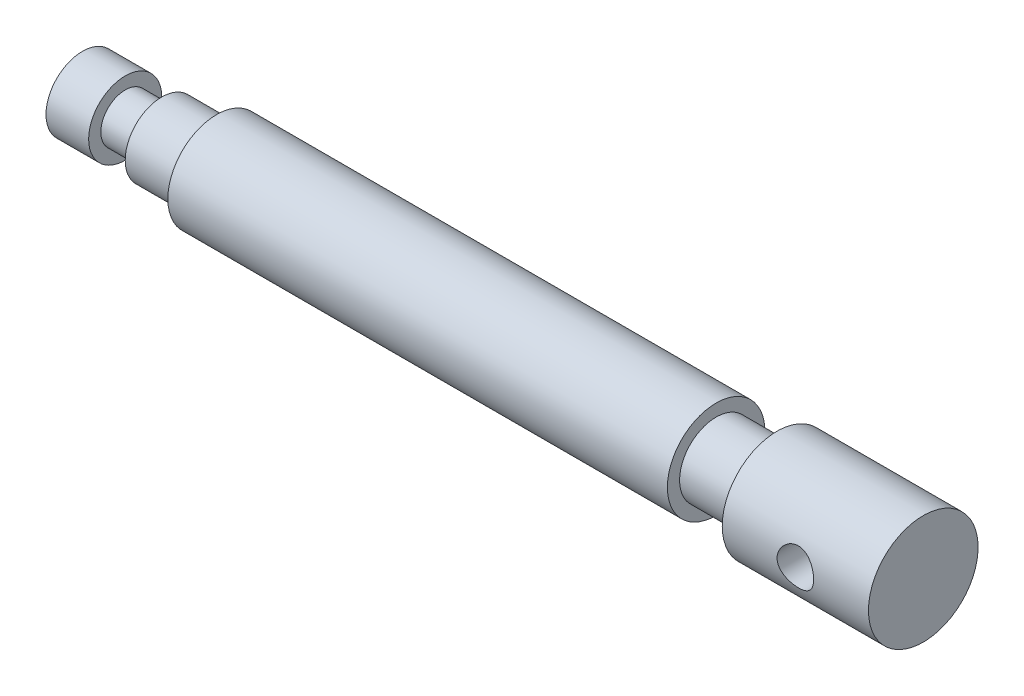
ISO-10303-21;
HEADER;
FILE_DESCRIPTION(('STEP AP214'),'2;1');
FILE_NAME('part.step','',(''),(''),'','','');
FILE_SCHEMA(('AUTOMOTIVE_DESIGN { 1 0 10303 214 1 1 1 1 }'));
ENDSEC;
DATA;
#1=APPLICATION_CONTEXT('core data for automotive mechanical design processes');
#2=APPLICATION_PROTOCOL_DEFINITION('international standard','automotive_design',2000,#1);
#3=PRODUCT_CONTEXT('',#1,'mechanical');
#4=PRODUCT('Part','Part','',(#3));
#5=PRODUCT_RELATED_PRODUCT_CATEGORY('part','',(#4));
#6=PRODUCT_DEFINITION_FORMATION('','',#4);
#7=PRODUCT_DEFINITION_CONTEXT('part definition',#1,'design');
#8=PRODUCT_DEFINITION('design','',#6,#7);
#9=PRODUCT_DEFINITION_SHAPE('','',#8);
#10=(LENGTH_UNIT() NAMED_UNIT(*) SI_UNIT(.MILLI.,.METRE.));
#11=(NAMED_UNIT(*) PLANE_ANGLE_UNIT() SI_UNIT($,.RADIAN.));
#12=(NAMED_UNIT(*) SI_UNIT($,.STERADIAN.) SOLID_ANGLE_UNIT());
#13=UNCERTAINTY_MEASURE_WITH_UNIT(LENGTH_MEASURE(1.E-05),#10,'distance_accuracy_value','');
#14=(GEOMETRIC_REPRESENTATION_CONTEXT(3) GLOBAL_UNCERTAINTY_ASSIGNED_CONTEXT((#13)) GLOBAL_UNIT_ASSIGNED_CONTEXT((#10,
#11,#12)) REPRESENTATION_CONTEXT('',''));
#15=CARTESIAN_POINT('',(0.,0.,0.));
#16=DIRECTION('',(0.,0.,1.));
#17=DIRECTION('',(1.,0.,0.));
#18=AXIS2_PLACEMENT_3D('',#15,#16,#17);
#19=CARTESIAN_POINT('',(0.,0.,0.));
#20=DIRECTION('',(1.,0.,0.));
#21=DIRECTION('',(0.,0.,-1.));
#22=AXIS2_PLACEMENT_3D('',#19,#20,#21);
#23=PLANE('',#22);
#24=CARTESIAN_POINT('',(0.,0.,0.));
#25=DIRECTION('',(-1.,0.,0.));
#26=DIRECTION('',(0.,0.,1.));
#27=AXIS2_PLACEMENT_3D('',#24,#25,#26);
#28=CIRCLE('',#27,6.);
#29=CARTESIAN_POINT('',(0.,0.,6.));
#30=VERTEX_POINT('',#29);
#31=EDGE_CURVE('E43',#30,#30,#28,.T.);
#32=ORIENTED_EDGE('',*,*,#31,.T.);
#33=EDGE_LOOP('',(#32));
#34=FACE_BOUND('',#33,.T.);
#35=ADVANCED_FACE('F32',(#34),#23,.F.);
#36=CARTESIAN_POINT('',(-23.4007089869124,0.,0.));
#37=DIRECTION('',(-1.,0.,0.));
#38=DIRECTION('',(0.,0.,1.));
#39=AXIS2_PLACEMENT_3D('',#36,#37,#38);
#40=CYLINDRICAL_SURFACE('',#39,6.);
#41=ORIENTED_EDGE('',*,*,#31,.F.);
#42=EDGE_LOOP('',(#41));
#43=FACE_BOUND('',#42,.T.);
#44=CARTESIAN_POINT('',(7.,0.,0.));
#45=DIRECTION('',(-1.,0.,0.));
#46=DIRECTION('',(0.,0.,1.));
#47=AXIS2_PLACEMENT_3D('',#44,#45,#46);
#48=CIRCLE('',#47,6.);
#49=CARTESIAN_POINT('',(7.,0.,6.));
#50=VERTEX_POINT('',#49);
#51=EDGE_CURVE('E47',#50,#50,#48,.T.);
#52=ORIENTED_EDGE('',*,*,#51,.T.);
#53=EDGE_LOOP('',(#52));
#54=FACE_BOUND('',#53,.T.);
#55=ADVANCED_FACE('F79',(#43,#54),#40,.T.);
#56=CARTESIAN_POINT('',(7.,6.,0.));
#57=DIRECTION('',(-1.,0.,0.));
#58=DIRECTION('',(0.,0.,1.));
#59=AXIS2_PLACEMENT_3D('',#56,#57,#58);
#60=PLANE('',#59);
#61=ORIENTED_EDGE('',*,*,#51,.F.);
#62=EDGE_LOOP('',(#61));
#63=FACE_BOUND('',#62,.T.);
#64=CARTESIAN_POINT('',(7.,0.,0.));
#65=DIRECTION('',(-1.,0.,0.));
#66=DIRECTION('',(0.,0.,1.));
#67=AXIS2_PLACEMENT_3D('',#64,#65,#66);
#68=CIRCLE('',#67,4.);
#69=CARTESIAN_POINT('',(7.,0.,4.));
#70=VERTEX_POINT('',#69);
#71=EDGE_CURVE('E52',#70,#70,#68,.T.);
#72=ORIENTED_EDGE('',*,*,#71,.T.);
#73=EDGE_LOOP('',(#72));
#74=FACE_BOUND('',#73,.T.);
#75=ADVANCED_FACE('F83',(#63,#74),#60,.F.);
#76=CARTESIAN_POINT('',(-23.4007089869124,0.,0.));
#77=DIRECTION('',(-1.,0.,0.));
#78=DIRECTION('',(0.,0.,1.));
#79=AXIS2_PLACEMENT_3D('',#76,#77,#78);
#80=CYLINDRICAL_SURFACE('',#79,4.);
#81=ORIENTED_EDGE('',*,*,#71,.F.);
#82=EDGE_LOOP('',(#81));
#83=FACE_BOUND('',#82,.T.);
#84=CARTESIAN_POINT('',(13.,0.,0.));
#85=DIRECTION('',(-1.,0.,0.));
#86=DIRECTION('',(0.,0.,1.));
#87=AXIS2_PLACEMENT_3D('',#84,#85,#86);
#88=CIRCLE('',#87,4.);
#89=CARTESIAN_POINT('',(13.,0.,4.));
#90=VERTEX_POINT('',#89);
#91=EDGE_CURVE('E151',#90,#90,#88,.T.);
#92=ORIENTED_EDGE('',*,*,#91,.T.);
#93=EDGE_LOOP('',(#92));
#94=FACE_BOUND('',#93,.T.);
#95=ADVANCED_FACE('F88',(#83,#94),#80,.T.);
#96=CARTESIAN_POINT('',(13.,4.,0.));
#97=DIRECTION('',(1.,0.,0.));
#98=DIRECTION('',(0.,0.,-1.));
#99=AXIS2_PLACEMENT_3D('',#96,#97,#98);
#100=PLANE('',#99);
#101=ORIENTED_EDGE('',*,*,#91,.F.);
#102=EDGE_LOOP('',(#101));
#103=FACE_BOUND('',#102,.T.);
#104=CARTESIAN_POINT('',(13.,0.,0.));
#105=DIRECTION('',(-1.,0.,0.));
#106=DIRECTION('',(0.,0.,1.));
#107=AXIS2_PLACEMENT_3D('',#104,#105,#106);
#108=CIRCLE('',#107,6.);
#109=CARTESIAN_POINT('',(13.,0.,6.));
#110=VERTEX_POINT('',#109);
#111=EDGE_CURVE('E148',#110,#110,#108,.T.);
#112=ORIENTED_EDGE('',*,*,#111,.T.);
#113=EDGE_LOOP('',(#112));
#114=FACE_BOUND('',#113,.T.);
#115=ADVANCED_FACE('F95',(#103,#114),#100,.F.);
#116=CARTESIAN_POINT('',(-23.4007089869124,0.,0.));
#117=DIRECTION('',(-1.,0.,0.));
#118=DIRECTION('',(0.,0.,1.));
#119=AXIS2_PLACEMENT_3D('',#116,#117,#118);
#120=CYLINDRICAL_SURFACE('',#119,6.);
#121=ORIENTED_EDGE('',*,*,#111,.F.);
#122=EDGE_LOOP('',(#121));
#123=FACE_BOUND('',#122,.T.);
#124=CARTESIAN_POINT('',(22.,0.,0.));
#125=DIRECTION('',(-1.,0.,0.));
#126=DIRECTION('',(0.,0.,1.));
#127=AXIS2_PLACEMENT_3D('',#124,#125,#126);
#128=CIRCLE('',#127,6.);
#129=CARTESIAN_POINT('',(22.,0.,6.));
#130=VERTEX_POINT('',#129);
#131=EDGE_CURVE('E145',#130,#130,#128,.T.);
#132=ORIENTED_EDGE('',*,*,#131,.T.);
#133=EDGE_LOOP('',(#132));
#134=FACE_BOUND('',#133,.T.);
#135=ADVANCED_FACE('F99',(#123,#134),#120,.T.);
#136=CARTESIAN_POINT('',(22.,6.,0.));
#137=DIRECTION('',(1.,0.,0.));
#138=DIRECTION('',(0.,0.,-1.));
#139=AXIS2_PLACEMENT_3D('',#136,#137,#138);
#140=PLANE('',#139);
#141=ORIENTED_EDGE('',*,*,#131,.F.);
#142=EDGE_LOOP('',(#141));
#143=FACE_BOUND('',#142,.T.);
#144=CARTESIAN_POINT('',(22.,0.,0.));
#145=DIRECTION('',(-1.,0.,0.));
#146=DIRECTION('',(0.,0.,1.));
#147=AXIS2_PLACEMENT_3D('',#144,#145,#146);
#148=CIRCLE('',#147,8.);
#149=CARTESIAN_POINT('',(22.,0.,8.));
#150=VERTEX_POINT('',#149);
#151=EDGE_CURVE('E142',#150,#150,#148,.T.);
#152=ORIENTED_EDGE('',*,*,#151,.T.);
#153=EDGE_LOOP('',(#152));
#154=FACE_BOUND('',#153,.T.);
#155=ADVANCED_FACE('F103',(#143,#154),#140,.F.);
#156=CARTESIAN_POINT('',(-23.4007089869124,0.,0.));
#157=DIRECTION('',(-1.,0.,0.));
#158=DIRECTION('',(0.,0.,1.));
#159=AXIS2_PLACEMENT_3D('',#156,#157,#158);
#160=CYLINDRICAL_SURFACE('',#159,8.);
#161=ORIENTED_EDGE('',*,*,#151,.F.);
#162=EDGE_LOOP('',(#161));
#163=FACE_BOUND('',#162,.T.);
#164=CARTESIAN_POINT('',(104.,0.,0.));
#165=DIRECTION('',(-1.,0.,0.));
#166=DIRECTION('',(0.,0.,1.));
#167=AXIS2_PLACEMENT_3D('',#164,#165,#166);
#168=CIRCLE('',#167,8.);
#169=CARTESIAN_POINT('',(104.,0.,8.));
#170=VERTEX_POINT('',#169);
#171=EDGE_CURVE('E139',#170,#170,#168,.T.);
#172=ORIENTED_EDGE('',*,*,#171,.T.);
#173=EDGE_LOOP('',(#172));
#174=FACE_BOUND('',#173,.T.);
#175=ADVANCED_FACE('F107',(#163,#174),#160,.T.);
#176=CARTESIAN_POINT('',(104.,8.,0.));
#177=DIRECTION('',(-1.,0.,0.));
#178=DIRECTION('',(0.,0.,1.));
#179=AXIS2_PLACEMENT_3D('',#176,#177,#178);
#180=PLANE('',#179);
#181=ORIENTED_EDGE('',*,*,#171,.F.);
#182=EDGE_LOOP('',(#181));
#183=FACE_BOUND('',#182,.T.);
#184=CARTESIAN_POINT('',(104.,0.,0.));
#185=DIRECTION('',(-1.,0.,0.));
#186=DIRECTION('',(0.,0.,1.));
#187=AXIS2_PLACEMENT_3D('',#184,#185,#186);
#188=CIRCLE('',#187,6.);
#189=CARTESIAN_POINT('',(104.,0.,6.));
#190=VERTEX_POINT('',#189);
#191=EDGE_CURVE('E132',#190,#190,#188,.T.);
#192=ORIENTED_EDGE('',*,*,#191,.T.);
#193=EDGE_LOOP('',(#192));
#194=FACE_BOUND('',#193,.T.);
#195=ADVANCED_FACE('F111',(#183,#194),#180,.F.);
#196=CARTESIAN_POINT('',(-23.4007089869124,0.,0.));
#197=DIRECTION('',(-1.,0.,0.));
#198=DIRECTION('',(0.,0.,1.));
#199=AXIS2_PLACEMENT_3D('',#196,#197,#198);
#200=CYLINDRICAL_SURFACE('',#199,6.);
#201=ORIENTED_EDGE('',*,*,#191,.F.);
#202=EDGE_LOOP('',(#201));
#203=FACE_BOUND('',#202,.T.);
#204=CARTESIAN_POINT('',(114.,0.,0.));
#205=DIRECTION('',(-1.,0.,0.));
#206=DIRECTION('',(0.,0.,1.));
#207=AXIS2_PLACEMENT_3D('',#204,#205,#206);
#208=CIRCLE('',#207,6.);
#209=CARTESIAN_POINT('',(114.,0.,6.));
#210=VERTEX_POINT('',#209);
#211=EDGE_CURVE('E126',#210,#210,#208,.T.);
#212=ORIENTED_EDGE('',*,*,#211,.T.);
#213=EDGE_LOOP('',(#212));
#214=FACE_BOUND('',#213,.T.);
#215=ADVANCED_FACE('F115',(#203,#214),#200,.T.);
#216=CARTESIAN_POINT('',(114.,6.,0.));
#217=DIRECTION('',(1.,0.,0.));
#218=DIRECTION('',(0.,0.,-1.));
#219=AXIS2_PLACEMENT_3D('',#216,#217,#218);
#220=PLANE('',#219);
#221=ORIENTED_EDGE('',*,*,#211,.F.);
#222=EDGE_LOOP('',(#221));
#223=FACE_BOUND('',#222,.T.);
#224=CARTESIAN_POINT('',(114.,0.,0.));
#225=DIRECTION('',(-1.,0.,0.));
#226=DIRECTION('',(0.,0.,1.));
#227=AXIS2_PLACEMENT_3D('',#224,#225,#226);
#228=CIRCLE('',#227,9.);
#229=CARTESIAN_POINT('',(114.,0.,9.));
#230=VERTEX_POINT('',#229);
#231=EDGE_CURVE('E129',#230,#230,#228,.T.);
#232=ORIENTED_EDGE('',*,*,#231,.T.);
#233=EDGE_LOOP('',(#232));
#234=FACE_BOUND('',#233,.T.);
#235=ADVANCED_FACE('F76',(#223,#234),#220,.F.);
#236=CARTESIAN_POINT('',(-23.4007089869124,0.,0.));
#237=DIRECTION('',(-1.,0.,0.));
#238=DIRECTION('',(0.,0.,1.));
#239=AXIS2_PLACEMENT_3D('',#236,#237,#238);
#240=CYLINDRICAL_SURFACE('',#239,9.);
#241=CARTESIAN_POINT('',(128.999477312383,0.,9.));
#242=CARTESIAN_POINT('',(129.002527490459,-0.163327881839876,9.00000061066477));
#243=CARTESIAN_POINT('',(128.992193229552,-0.326899560264671,8.99551314704815));
#244=CARTESIAN_POINT('',(128.945159763351,-0.649728841487302,8.97797279665083));
#245=CARTESIAN_POINT('',(128.908458767397,-0.80898615051846,8.96491932812712));
#246=CARTESIAN_POINT('',(128.810097421898,-1.11847592093075,8.93158563638168));
#247=CARTESIAN_POINT('',(128.748476712084,-1.26872228217279,8.91131689657828));
#248=CARTESIAN_POINT('',(128.602235613487,-1.55669328191847,8.86555085070725));
#249=CARTESIAN_POINT('',(128.517610612165,-1.69441540181645,8.84005249631355));
#250=CARTESIAN_POINT('',(128.32479635742,-1.95807846397704,8.78547744315961));
#251=CARTESIAN_POINT('',(128.215971660345,-2.083536933449,8.75631582520655));
#252=CARTESIAN_POINT('',(127.979106270205,-2.31482662253438,8.69803601158933));
#253=CARTESIAN_POINT('',(127.85106106663,-2.4206532220345,8.66891782774212));
#254=CARTESIAN_POINT('',(127.574455195578,-2.61301268985936,8.61292868409607));
#255=CARTESIAN_POINT('',(127.425372744222,-2.69882736153785,8.58615825985324));
#256=CARTESIAN_POINT('',(127.113888160603,-2.84402430861066,8.53916787935211));
#257=CARTESIAN_POINT('',(126.951489650729,-2.90341374444095,8.51894614900149));
#258=CARTESIAN_POINT('',(126.623120871115,-2.99222014336445,8.48815536186549));
#259=CARTESIAN_POINT('',(126.457408140531,-3.02249117683116,8.47731225726469));
#260=CARTESIAN_POINT('',(126.122928228779,-3.05491526828602,8.46568425713396));
#261=CARTESIAN_POINT('',(125.954162095575,-3.05707779677416,8.46489597387001));
#262=CARTESIAN_POINT('',(125.626937908099,-3.03379487301386,8.47326429065093));
#263=CARTESIAN_POINT('',(125.468372018028,-3.0096607746303,8.48194853896833));
#264=CARTESIAN_POINT('',(125.157709889819,-2.93674157862371,8.50746872736906));
#265=CARTESIAN_POINT('',(125.005614319777,-2.88795394205208,8.52430550703466));
#266=CARTESIAN_POINT('',(124.710019929326,-2.76660684725138,8.56446104377732));
#267=CARTESIAN_POINT('',(124.566645340641,-2.69377068770755,8.58785474724017));
#268=CARTESIAN_POINT('',(124.293809636597,-2.52656192723921,8.63852407658121));
#269=CARTESIAN_POINT('',(124.164352485224,-2.43218321431031,8.66580080331386));
#270=CARTESIAN_POINT('',(123.915873377772,-2.2187258066288,8.72296207264693));
#271=CARTESIAN_POINT('',(123.797752793645,-2.09861252382033,8.75290837872274));
#272=CARTESIAN_POINT('',(123.583080054168,-1.84001522235148,8.81089563612611));
#273=CARTESIAN_POINT('',(123.486530588665,-1.70152891606294,8.83893634952947));
#274=CARTESIAN_POINT('',(123.316572451131,-1.40755619439191,8.89051917263674));
#275=CARTESIAN_POINT('',(123.243504262399,-1.25186014688302,8.91399329885936));
#276=CARTESIAN_POINT('',(123.124902450381,-0.929416147862092,8.95335216055698));
#277=CARTESIAN_POINT('',(123.07935958109,-0.762671928438807,8.96923944414455));
#278=CARTESIAN_POINT('',(123.018857509404,-0.430309895345415,8.99118494398541));
#279=CARTESIAN_POINT('',(123.002702392456,-0.264934950534401,8.99762533298479));
#280=CARTESIAN_POINT('',(122.997923225779,0.0662974299435991,9.00127860981426));
#281=CARTESIAN_POINT('',(123.009293929312,0.232154767641936,8.99849325613982));
#282=CARTESIAN_POINT('',(123.058306828745,0.554115785274278,8.98432642181965));
#283=CARTESIAN_POINT('',(123.095102791907,0.710361930429039,8.97322088742239));
#284=CARTESIAN_POINT('',(123.192782521296,1.01442085464641,8.94395311830769));
#285=CARTESIAN_POINT('',(123.253669020807,1.16223267458203,8.92579008285852));
#286=CARTESIAN_POINT('',(123.399342279281,1.44908648115283,8.88378667352938));
#287=CARTESIAN_POINT('',(123.484652567261,1.58784410240857,8.85982394524899));
#288=CARTESIAN_POINT('',(123.676194902158,1.8494825910347,8.80892771471358));
#289=CARTESIAN_POINT('',(123.782433246339,1.97235866116061,8.78199331935786));
#290=CARTESIAN_POINT('',(124.018618940931,2.20467673736313,8.72664471768828));
#291=CARTESIAN_POINT('',(124.149435894671,2.3132340203938,8.69821970724471));
#292=CARTESIAN_POINT('',(124.427934988762,2.50699559769301,8.64436909698547));
#293=CARTESIAN_POINT('',(124.575617922348,2.59219879293643,8.61894363835842));
#294=CARTESIAN_POINT('',(124.884403286695,2.73678163616397,8.57413542683686));
#295=CARTESIAN_POINT('',(125.045532519509,2.79610816605801,8.55476512647655));
#296=CARTESIAN_POINT('',(125.376295274571,2.88646010902523,8.52470845332066));
#297=CARTESIAN_POINT('',(125.545924932877,2.91749825989994,8.51401817228903));
#298=CARTESIAN_POINT('',(125.879680787467,2.94918239919429,8.50309261071332));
#299=CARTESIAN_POINT('',(126.043653670073,2.95128084432331,8.50235771359261));
#300=CARTESIAN_POINT('',(126.369511683307,2.92873749805083,8.51014898865102));
#301=CARTESIAN_POINT('',(126.531396995984,2.90409805455276,8.51867434766998));
#302=CARTESIAN_POINT('',(126.844713000789,2.82991308015546,8.54359744042526));
#303=CARTESIAN_POINT('',(126.996298548278,2.78095373900554,8.55980949950158));
#304=CARTESIAN_POINT('',(127.28919848734,2.66005093836726,8.59814690884385));
#305=CARTESIAN_POINT('',(127.430510697066,2.58810261388912,8.62027351059894));
#306=CARTESIAN_POINT('',(127.705182496545,2.41983384131197,8.66904640085157));
#307=CARTESIAN_POINT('',(127.837975713493,2.3226324671914,8.69584118429261));
#308=CARTESIAN_POINT('',(128.085876483304,2.10799684143372,8.75034819676065));
#309=CARTESIAN_POINT('',(128.200978886423,1.99055671938057,8.77806069008764));
#310=CARTESIAN_POINT('',(128.415094625914,1.73294331843201,8.83260578722984));
#311=CARTESIAN_POINT('',(128.513238854817,1.59202726907262,8.85935375370506));
#312=CARTESIAN_POINT('',(128.68441827601,1.29487333543991,8.90763262334093));
#313=CARTESIAN_POINT('',(128.757458685492,1.13863864344299,8.92916461023565));
#314=CARTESIAN_POINT('',(128.873757480259,0.821165309044798,8.96382858504189));
#315=CARTESIAN_POINT('',(128.918016122837,0.660324553857875,8.97724142505026));
#316=CARTESIAN_POINT('',(128.979315698627,0.333072686684504,8.99532550195261));
#317=CARTESIAN_POINT('',(128.996364845302,0.166663271146044,8.99999937686458));
#318=CARTESIAN_POINT('',(128.999477312383,0.,9.));
#319=B_SPLINE_CURVE_WITH_KNOTS('',3,(#241,#242,#243,#244,#245,#246,#247,#248,#249,#250,#251,
#252,#253,#254,#255,#256,#257,#258,#259,#260,#261,#262,#263,#264,#265,#266,#267,#268,#269,#270,
#271,#272,#273,#274,#275,#276,#277,#278,#279,#280,#281,#282,#283,#284,#285,#286,#287,#288,#289,
#290,#291,#292,#293,#294,#295,#296,#297,#298,#299,#300,#301,#302,#303,#304,#305,#306,#307,#308,
#309,#310,#311,#312,#313,#314,#315,#316,#317,#318),.UNSPECIFIED.,.T.,.F.,(4,2,2,2,2,2,2,2,2,2,2,
2,2,2,2,2,2,2,2,2,2,2,2,2,2,2,2,2,2,2,2,2,2,2,2,2,2,2,4),(0.,0.489458667741643,
0.978950579525546,1.46766690127903,1.95648128679796,2.46008395566358,2.9638049911389,
3.48349865715992,4.003051416102,4.50685326906889,5.01048537344279,5.49010574008122,
5.96977551056975,6.45516874240035,6.94069986045229,7.45165479098175,7.96267340040384,
8.48079857091318,8.99874960160118,9.4951065278983,9.99136885030172,10.471862885421,
10.9524114524792,11.4441501313595,11.9360370013553,12.4506847050642,12.9653566235354,
13.4810801142312,13.9965712680485,14.4860904862766,14.9755667223953,15.4537790750546,
15.9320926953844,16.4300848992819,16.9282217938058,17.4470930343623,17.9658563754026,
18.4654613296096,18.9649154444715),.UNSPECIFIED.);
#320=CARTESIAN_POINT('',(128.999477312383,0.,9.));
#321=VERTEX_POINT('',#320);
#322=EDGE_CURVE('E10',#321,#321,#319,.T.);
#323=ORIENTED_EDGE('',*,*,#322,.T.);
#324=EDGE_LOOP('',(#323));
#325=FACE_BOUND('',#324,.T.);
#326=CARTESIAN_POINT('',(126.,-2.94714586342988,-8.50378334976075));
#327=CARTESIAN_POINT('',(126.163404524508,-2.94714664060754,-8.50378281626053));
#328=CARTESIAN_POINT('',(126.326804399471,-2.93372078388262,-8.50847161313625));
#329=CARTESIAN_POINT('',(126.648763262983,-2.88055590729163,-8.52661531216435));
#330=CARTESIAN_POINT('',(126.807321449617,-2.84081255299941,-8.54007165830435));
#331=CARTESIAN_POINT('',(127.114880678992,-2.73657110688181,-8.57403923403433));
#332=CARTESIAN_POINT('',(127.263899788328,-2.67212153011911,-8.59453662912675));
#333=CARTESIAN_POINT('',(127.549080145644,-2.52047354862584,-8.64022348942162));
#334=CARTESIAN_POINT('',(127.685238547661,-2.43327012465593,-8.66541398951848));
#335=CARTESIAN_POINT('',(127.946159887015,-2.23494822990054,-8.71870947041102));
#336=CARTESIAN_POINT('',(128.070346286015,-2.12309033174711,-8.74688619062012));
#337=CARTESIAN_POINT('',(128.298620403674,-1.88023091086523,-8.80228527194008));
#338=CARTESIAN_POINT('',(128.402704894747,-1.74922631984418,-8.82950747921994));
#339=CARTESIAN_POINT('',(128.590436691989,-1.46758542267576,-8.8807193422924));
#340=CARTESIAN_POINT('',(128.673479911854,-1.31652608297587,-8.90460612539463));
#341=CARTESIAN_POINT('',(128.812774755383,-1.00165352114866,-8.94549312796236));
#342=CARTESIAN_POINT('',(128.869033599531,-0.837843750130247,-8.9624952032103));
#343=CARTESIAN_POINT('',(128.951207563897,-0.50817782030294,-8.98710815008367));
#344=CARTESIAN_POINT('',(128.978110338771,-0.342591166821284,-8.99502519098132));
#345=CARTESIAN_POINT('',(129.003948880082,-0.00908554140864758,-9.00153902298085));
#346=CARTESIAN_POINT('',(129.002891854957,0.158832818216949,-9.0001382164274));
#347=CARTESIAN_POINT('',(128.973467236302,0.485246046991122,-8.98833594076106));
#348=CARTESIAN_POINT('',(128.946172414577,0.643852208531223,-8.97828964080953));
#349=CARTESIAN_POINT('',(128.866821057059,0.954040383848566,-8.95064616887768));
#350=CARTESIAN_POINT('',(128.814762843061,1.10562192080557,-8.93304848515092));
#351=CARTESIAN_POINT('',(128.686736048082,1.39980955552387,-8.89173250745699));
#352=CARTESIAN_POINT('',(128.61046218436,1.5422714929152,-8.86793680477414));
#353=CARTESIAN_POINT('',(128.436420883654,1.81266589243038,-8.81664391285503));
#354=CARTESIAN_POINT('',(128.338647470017,1.94059429935598,-8.78914569518369));
#355=CARTESIAN_POINT('',(128.118976819621,2.18467457219414,-8.73176156785368));
#356=CARTESIAN_POINT('',(127.996160526476,2.29998840330414,-8.70182419650796));
#357=CARTESIAN_POINT('',(127.73265382282,2.50866382864358,-8.64397828483488));
#358=CARTESIAN_POINT('',(127.591960662816,2.60202203974911,-8.61607005763382));
#359=CARTESIAN_POINT('',(127.29403912319,2.76530844435686,-8.56507559138206));
#360=CARTESIAN_POINT('',(127.136603606047,2.83488363559465,-8.54206376872433));
#361=CARTESIAN_POINT('',(126.811285817357,2.94630090047343,-8.50428203688344));
#362=CARTESIAN_POINT('',(126.643407956381,2.98815459709698,-8.48950867391554));
#363=CARTESIAN_POINT('',(126.310084933765,3.04124762049095,-8.47063018451287));
#364=CARTESIAN_POINT('',(126.144871725754,3.05378295332956,-8.46607382061684));
#365=CARTESIAN_POINT('',(125.814671552658,3.05155693813074,-8.46687703881333));
#366=CARTESIAN_POINT('',(125.649684551928,3.0368005479584,-8.47223481988395));
#367=CARTESIAN_POINT('',(125.330529102864,2.98157142677342,-8.49182135776442));
#368=CARTESIAN_POINT('',(125.176183709547,2.94199948509757,-8.5057390673142));
#369=CARTESIAN_POINT('',(124.876369181282,2.83933653320469,-8.5405553648471));
#370=CARTESIAN_POINT('',(124.730901625228,2.77624135356135,-8.5614551903219));
#371=CARTESIAN_POINT('',(124.447858737459,2.6260380487719,-8.60873356169347));
#372=CARTESIAN_POINT('',(124.310680072075,2.53823176165665,-8.63526485474507));
#373=CARTESIAN_POINT('',(124.052561842849,2.34187560989151,-8.6905699601407));
#374=CARTESIAN_POINT('',(123.931627084016,2.23331963031238,-8.71934443206505));
#375=CARTESIAN_POINT('',(123.703416047728,1.99232873052056,-8.77762464970194));
#376=CARTESIAN_POINT('',(123.597076829943,1.8589962349808,-8.80709897335269));
#377=CARTESIAN_POINT('',(123.408251572956,1.57565348918532,-8.8621732605661));
#378=CARTESIAN_POINT('',(123.325764686513,1.42564383156826,-8.8877733617266));
#379=CARTESIAN_POINT('',(123.187739685415,1.11393781506984,-8.93217407148206));
#380=CARTESIAN_POINT('',(123.132026168556,0.952325722225532,-8.95101872478809));
#381=CARTESIAN_POINT('',(123.04881677382,0.621262079479737,-8.98006661518402));
#382=CARTESIAN_POINT('',(123.021310710358,0.4518133824561,-8.99027297129134));
#383=CARTESIAN_POINT('',(122.996213767183,0.118451296098276,-9.00069311326474));
#384=CARTESIAN_POINT('',(122.997277638203,-0.0453479418474133,-9.00135400294262));
#385=CARTESIAN_POINT('',(123.025971924439,-0.370380221371236,-8.99384452598833));
#386=CARTESIAN_POINT('',(123.053600184458,-0.531613470052092,-8.9856748757807));
#387=CARTESIAN_POINT('',(123.133746703728,-0.844382607398007,-8.96165473474956));
#388=CARTESIAN_POINT('',(123.185862646059,-0.99603184839584,-8.94592830561669));
#389=CARTESIAN_POINT('',(123.313132593291,-1.28853060359403,-8.90850460094796));
#390=CARTESIAN_POINT('',(123.388290765591,-1.42937815844541,-8.88680624540731));
#391=CARTESIAN_POINT('',(123.562708536306,-1.70193970300586,-8.83873675692283));
#392=CARTESIAN_POINT('',(123.662756056145,-1.83312392127261,-8.81222259176325));
#393=CARTESIAN_POINT('',(123.882772173469,-2.07729106908655,-8.75788425544202));
#394=CARTESIAN_POINT('',(124.002747126788,-2.1902681687673,-8.73005966835776));
#395=CARTESIAN_POINT('',(124.264828066761,-2.39929539365598,-8.67499491728431));
#396=CARTESIAN_POINT('',(124.40761653293,-2.49450979097831,-8.64782026735342));
#397=CARTESIAN_POINT('',(124.708003280708,-2.65949386768108,-8.5985198165073));
#398=CARTESIAN_POINT('',(124.865597679089,-2.72927019553477,-8.57639269694028));
#399=CARTESIAN_POINT('',(125.183885472047,-2.83844451050213,-8.5408663714775));
#400=CARTESIAN_POINT('',(125.344116790576,-2.87907308408619,-8.5271178589316));
#401=CARTESIAN_POINT('',(125.6695681514,-2.93341872446408,-8.50857816322197));
#402=CARTESIAN_POINT('',(125.834786452232,-2.94714507764822,-8.50378388916726));
#403=CARTESIAN_POINT('',(126.,-2.94714586342988,-8.50378334976075));
#404=B_SPLINE_CURVE_WITH_KNOTS('',3,(#326,#327,#328,#329,#330,#331,#332,#333,#334,#335,#336,
#337,#338,#339,#340,#341,#342,#343,#344,#345,#346,#347,#348,#349,#350,#351,#352,#353,#354,#355,
#356,#357,#358,#359,#360,#361,#362,#363,#364,#365,#366,#367,#368,#369,#370,#371,#372,#373,#374,
#375,#376,#377,#378,#379,#380,#381,#382,#383,#384,#385,#386,#387,#388,#389,#390,#391,#392,#393,
#394,#395,#396,#397,#398,#399,#400,#401,#402,#403),.UNSPECIFIED.,.T.,.F.,(4,2,2,2,2,2,2,2,2,2,2,
2,2,2,2,2,2,2,2,2,2,2,2,2,2,2,2,2,2,2,2,2,2,2,2,2,2,2,4),(0.,0.489601754398063,
0.979284165045506,1.46800988250248,1.95684349855634,2.46304012282707,2.96931795515966,
3.48880518430974,4.00815229160369,4.50942956294805,5.01057759906984,5.49207014476709,
5.97359532567712,6.46144964581006,6.94943975622066,7.46040523091752,7.9714493883632,
8.48977919529167,9.0078915406985,9.5026287409332,9.99727607511706,10.4749318730633,
10.9526723744084,11.4455657320715,11.9386045698638,12.4553642451328,12.972105562726,
13.4854137357256,13.9985364901247,14.4875425403291,14.9765089202935,15.4577086812129,
15.9389955228973,16.438065585619,16.937295132979,17.4560670820844,17.974703348006,
18.4698963648807,18.9649184157139),.UNSPECIFIED.);
#405=CARTESIAN_POINT('',(126.,-2.94714586342988,-8.50378334976075));
#406=VERTEX_POINT('',#405);
#407=EDGE_CURVE('E55',#406,#406,#404,.T.);
#408=ORIENTED_EDGE('',*,*,#407,.T.);
#409=EDGE_LOOP('',(#408));
#410=FACE_BOUND('',#409,.T.);
#411=ORIENTED_EDGE('',*,*,#231,.F.);
#412=EDGE_LOOP('',(#411));
#413=FACE_BOUND('',#412,.T.);
#414=CARTESIAN_POINT('',(138.,0.,0.));
#415=DIRECTION('',(-1.,0.,0.));
#416=DIRECTION('',(0.,0.,1.));
#417=AXIS2_PLACEMENT_3D('',#414,#415,#416);
#418=CIRCLE('',#417,9.);
#419=CARTESIAN_POINT('',(138.,0.,9.));
#420=VERTEX_POINT('',#419);
#421=EDGE_CURVE('E60',#420,#420,#418,.T.);
#422=ORIENTED_EDGE('',*,*,#421,.T.);
#423=EDGE_LOOP('',(#422));
#424=FACE_BOUND('',#423,.T.);
#425=ADVANCED_FACE('F61',(#325,#410,#413,#424),#240,.T.);
#426=CARTESIAN_POINT('',(138.,9.,0.));
#427=DIRECTION('',(-1.,0.,0.));
#428=DIRECTION('',(0.,0.,1.));
#429=AXIS2_PLACEMENT_3D('',#426,#427,#428);
#430=PLANE('',#429);
#431=ORIENTED_EDGE('',*,*,#421,.F.);
#432=EDGE_LOOP('',(#431));
#433=FACE_BOUND('',#432,.T.);
#434=ADVANCED_FACE('F68',(#433),#430,.F.);
#435=CARTESIAN_POINT('',(126.,-0.0559986830173714,8.99982578428607));
#436=DIRECTION('',(0.,-0.00622207589081959,0.999980642698452));
#437=DIRECTION('',(0.,-0.999980642698452,-0.00622207589081959));
#438=AXIS2_PLACEMENT_3D('',#435,#436,#437);
#439=CYLINDRICAL_SURFACE('',#438,3.);
#440=ORIENTED_EDGE('',*,*,#407,.F.);
#441=EDGE_LOOP('',(#440));
#442=FACE_BOUND('',#441,.T.);
#443=ORIENTED_EDGE('',*,*,#322,.F.);
#444=EDGE_LOOP('',(#443));
#445=FACE_BOUND('',#444,.T.);
#446=ADVANCED_FACE('F65',(#442,#445),#439,.F.);
#447=CLOSED_SHELL('',(#35,#55,#75,#95,#115,#135,#155,#175,#195,#215,#235,#425,#434,#446));
#448=MANIFOLD_SOLID_BREP('B2',#447);
#449=ADVANCED_BREP_SHAPE_REPRESENTATION('',(#18,#448),#14);
#450=SHAPE_DEFINITION_REPRESENTATION(#9,#449);
ENDSEC;
END-ISO-10303-21;
